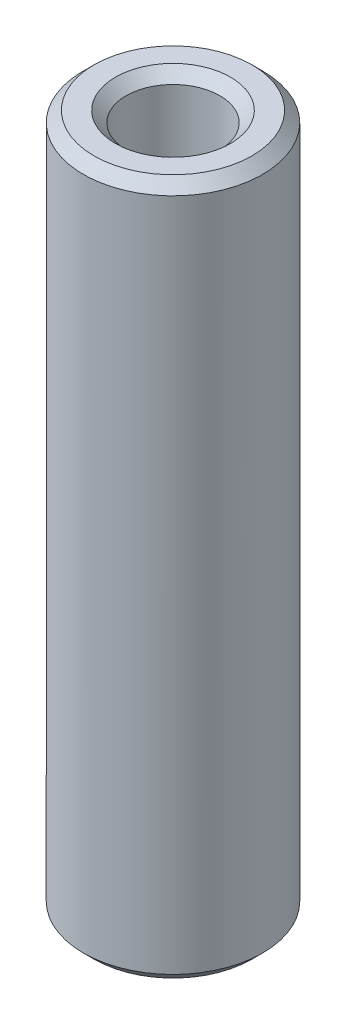
ISO-10303-21;
HEADER;
FILE_DESCRIPTION(('STEP AP214'),'2;1');
FILE_NAME('part.step','',(''),(''),'','','');
FILE_SCHEMA(('AUTOMOTIVE_DESIGN { 1 0 10303 214 1 1 1 1 }'));
ENDSEC;
DATA;
#1=APPLICATION_CONTEXT('core data for automotive mechanical design processes');
#2=APPLICATION_PROTOCOL_DEFINITION('international standard','automotive_design',2000,#1);
#3=PRODUCT_CONTEXT('',#1,'mechanical');
#4=PRODUCT('Part','Part','',(#3));
#5=PRODUCT_RELATED_PRODUCT_CATEGORY('part','',(#4));
#6=PRODUCT_DEFINITION_FORMATION('','',#4);
#7=PRODUCT_DEFINITION_CONTEXT('part definition',#1,'design');
#8=PRODUCT_DEFINITION('design','',#6,#7);
#9=PRODUCT_DEFINITION_SHAPE('','',#8);
#10=(LENGTH_UNIT() NAMED_UNIT(*) SI_UNIT(.MILLI.,.METRE.));
#11=(NAMED_UNIT(*) PLANE_ANGLE_UNIT() SI_UNIT($,.RADIAN.));
#12=(NAMED_UNIT(*) SI_UNIT($,.STERADIAN.) SOLID_ANGLE_UNIT());
#13=UNCERTAINTY_MEASURE_WITH_UNIT(LENGTH_MEASURE(1.E-05),#10,'distance_accuracy_value','');
#14=(GEOMETRIC_REPRESENTATION_CONTEXT(3) GLOBAL_UNCERTAINTY_ASSIGNED_CONTEXT((#13)) GLOBAL_UNIT_ASSIGNED_CONTEXT((#10,
#11,#12)) REPRESENTATION_CONTEXT('',''));
#15=CARTESIAN_POINT('',(0.,0.,0.));
#16=DIRECTION('',(0.,0.,1.));
#17=DIRECTION('',(1.,0.,0.));
#18=AXIS2_PLACEMENT_3D('',#15,#16,#17);
#19=CARTESIAN_POINT('',(0.,26.,0.));
#20=DIRECTION('',(0.,1.,0.));
#21=DIRECTION('',(0.,0.,1.));
#22=AXIS2_PLACEMENT_3D('',#19,#20,#21);
#23=PLANE('',#22);
#24=CARTESIAN_POINT('',(0.,26.,0.));
#25=DIRECTION('',(0.,1.,0.));
#26=DIRECTION('',(0.,0.,1.));
#27=AXIS2_PLACEMENT_3D('',#24,#25,#26);
#28=CIRCLE('',#27,2.95000000000001);
#29=CARTESIAN_POINT('',(0.,26.,2.95000000000001));
#30=VERTEX_POINT('',#29);
#31=EDGE_CURVE('E10',#30,#30,#28,.T.);
#32=ORIENTED_EDGE('',*,*,#31,.T.);
#33=EDGE_LOOP('',(#32));
#34=FACE_BOUND('',#33,.T.);
#35=CARTESIAN_POINT('',(0.,26.,0.));
#36=DIRECTION('',(0.,1.,0.));
#37=DIRECTION('',(0.,0.,1.));
#38=AXIS2_PLACEMENT_3D('',#35,#36,#37);
#39=CIRCLE('',#38,2.15000000000001);
#40=CARTESIAN_POINT('',(0.,26.,2.15000000000001));
#41=VERTEX_POINT('',#40);
#42=EDGE_CURVE('E41',#41,#41,#39,.F.);
#43=ORIENTED_EDGE('',*,*,#42,.T.);
#44=EDGE_LOOP('',(#43));
#45=FACE_BOUND('',#44,.T.);
#46=ADVANCED_FACE('F33',(#34,#45),#23,.T.);
#47=CARTESIAN_POINT('',(0.,0.,0.));
#48=DIRECTION('',(0.,1.,0.));
#49=DIRECTION('',(0.,0.,1.));
#50=AXIS2_PLACEMENT_3D('',#47,#48,#49);
#51=PLANE('',#50);
#52=CARTESIAN_POINT('',(0.,0.,0.));
#53=DIRECTION('',(0.,1.,0.));
#54=DIRECTION('',(0.,0.,1.));
#55=AXIS2_PLACEMENT_3D('',#52,#53,#54);
#56=CIRCLE('',#55,2.94999999999998);
#57=CARTESIAN_POINT('',(0.,0.,2.94999999999998));
#58=VERTEX_POINT('',#57);
#59=EDGE_CURVE('E54',#58,#58,#56,.F.);
#60=ORIENTED_EDGE('',*,*,#59,.T.);
#61=EDGE_LOOP('',(#60));
#62=FACE_BOUND('',#61,.T.);
#63=CARTESIAN_POINT('',(0.,0.,0.));
#64=DIRECTION('',(0.,1.,0.));
#65=DIRECTION('',(0.,0.,1.));
#66=AXIS2_PLACEMENT_3D('',#63,#64,#65);
#67=CIRCLE('',#66,2.15);
#68=CARTESIAN_POINT('',(0.,0.,2.15));
#69=VERTEX_POINT('',#68);
#70=EDGE_CURVE('E57',#69,#69,#67,.T.);
#71=ORIENTED_EDGE('',*,*,#70,.T.);
#72=EDGE_LOOP('',(#71));
#73=FACE_BOUND('',#72,.T.);
#74=ADVANCED_FACE('F83',(#62,#73),#51,.F.);
#75=CARTESIAN_POINT('',(0.,26.,0.));
#76=DIRECTION('',(0.,-1.,0.));
#77=DIRECTION('',(0.,0.,-1.));
#78=AXIS2_PLACEMENT_3D('',#75,#76,#77);
#79=CYLINDRICAL_SURFACE('',#78,3.35);
#80=CARTESIAN_POINT('',(0.,0.400000000000022,0.));
#81=DIRECTION('',(0.,1.,0.));
#82=DIRECTION('',(0.,0.,1.));
#83=AXIS2_PLACEMENT_3D('',#80,#81,#82);
#84=CIRCLE('',#83,3.35);
#85=CARTESIAN_POINT('',(0.,0.400000000000018,-3.35));
#86=VERTEX_POINT('',#85);
#87=EDGE_CURVE('E60',#86,#86,#84,.T.);
#88=CARTESIAN_POINT('',(0.,25.6,0.));
#89=DIRECTION('',(0.,1.,0.));
#90=DIRECTION('',(0.,0.,1.));
#91=AXIS2_PLACEMENT_3D('',#88,#89,#90);
#92=CIRCLE('',#91,3.35);
#93=CARTESIAN_POINT('',(0.,25.6,-3.35));
#94=VERTEX_POINT('',#93);
#95=EDGE_CURVE('E63',#94,#94,#92,.F.);
#96=CARTESIAN_POINT('',(0.,0.400000000000018,-3.35));
#97=CARTESIAN_POINT('',(0.,0.662500000000018,-3.35));
#98=CARTESIAN_POINT('',(0.,0.925000000000018,-3.35));
#99=CARTESIAN_POINT('',(0.,1.45000000000002,-3.35));
#100=CARTESIAN_POINT('',(0.,1.71250000000002,-3.35));
#101=CARTESIAN_POINT('',(0.,2.23750000000002,-3.35));
#102=CARTESIAN_POINT('',(0.,2.50000000000002,-3.35));
#103=CARTESIAN_POINT('',(0.,3.02500000000002,-3.35));
#104=CARTESIAN_POINT('',(0.,3.28750000000002,-3.35));
#105=CARTESIAN_POINT('',(0.,3.81250000000002,-3.35));
#106=CARTESIAN_POINT('',(0.,4.07500000000002,-3.35));
#107=CARTESIAN_POINT('',(0.,4.60000000000002,-3.35));
#108=CARTESIAN_POINT('',(0.,4.86250000000002,-3.35));
#109=CARTESIAN_POINT('',(0.,5.38750000000002,-3.35));
#110=CARTESIAN_POINT('',(0.,5.65000000000002,-3.35));
#111=CARTESIAN_POINT('',(0.,6.17500000000002,-3.35));
#112=CARTESIAN_POINT('',(0.,6.43750000000002,-3.35));
#113=CARTESIAN_POINT('',(0.,6.96250000000002,-3.35));
#114=CARTESIAN_POINT('',(0.,7.22500000000002,-3.35));
#115=CARTESIAN_POINT('',(0.,7.75000000000002,-3.35));
#116=CARTESIAN_POINT('',(0.,8.01250000000002,-3.35));
#117=CARTESIAN_POINT('',(0.,8.53750000000002,-3.35));
#118=CARTESIAN_POINT('',(0.,8.80000000000002,-3.35));
#119=CARTESIAN_POINT('',(0.,9.32500000000002,-3.35));
#120=CARTESIAN_POINT('',(0.,9.58750000000001,-3.35));
#121=CARTESIAN_POINT('',(0.,10.1125,-3.35));
#122=CARTESIAN_POINT('',(0.,10.375,-3.35));
#123=CARTESIAN_POINT('',(0.,10.9,-3.35));
#124=CARTESIAN_POINT('',(0.,11.1625,-3.35));
#125=CARTESIAN_POINT('',(0.,11.6875,-3.35));
#126=CARTESIAN_POINT('',(0.,11.95,-3.35));
#127=CARTESIAN_POINT('',(0.,12.475,-3.35));
#128=CARTESIAN_POINT('',(0.,12.7375,-3.35));
#129=CARTESIAN_POINT('',(0.,13.2625,-3.35));
#130=CARTESIAN_POINT('',(0.,13.525,-3.35));
#131=CARTESIAN_POINT('',(0.,14.05,-3.35));
#132=CARTESIAN_POINT('',(0.,14.3125,-3.35));
#133=CARTESIAN_POINT('',(0.,14.8375,-3.35));
#134=CARTESIAN_POINT('',(0.,15.1,-3.35));
#135=CARTESIAN_POINT('',(0.,15.625,-3.35));
#136=CARTESIAN_POINT('',(0.,15.8875,-3.35));
#137=CARTESIAN_POINT('',(0.,16.4125,-3.35));
#138=CARTESIAN_POINT('',(0.,16.675,-3.35));
#139=CARTESIAN_POINT('',(0.,17.2,-3.35));
#140=CARTESIAN_POINT('',(0.,17.4625,-3.35));
#141=CARTESIAN_POINT('',(0.,17.9875,-3.35));
#142=CARTESIAN_POINT('',(0.,18.25,-3.35));
#143=CARTESIAN_POINT('',(0.,18.775,-3.35));
#144=CARTESIAN_POINT('',(0.,19.0375,-3.35));
#145=CARTESIAN_POINT('',(0.,19.5625,-3.35));
#146=CARTESIAN_POINT('',(0.,19.825,-3.35));
#147=CARTESIAN_POINT('',(0.,20.35,-3.35));
#148=CARTESIAN_POINT('',(0.,20.6125,-3.35));
#149=CARTESIAN_POINT('',(0.,21.1375,-3.35));
#150=CARTESIAN_POINT('',(0.,21.4,-3.35));
#151=CARTESIAN_POINT('',(0.,21.925,-3.35));
#152=CARTESIAN_POINT('',(0.,22.1875,-3.35));
#153=CARTESIAN_POINT('',(0.,22.7125,-3.35));
#154=CARTESIAN_POINT('',(0.,22.975,-3.35));
#155=CARTESIAN_POINT('',(0.,23.5,-3.35));
#156=CARTESIAN_POINT('',(0.,23.7625,-3.35));
#157=CARTESIAN_POINT('',(0.,24.2875,-3.35));
#158=CARTESIAN_POINT('',(0.,24.55,-3.35));
#159=CARTESIAN_POINT('',(0.,25.075,-3.35));
#160=CARTESIAN_POINT('',(0.,25.3375,-3.35));
#161=CARTESIAN_POINT('',(0.,25.6,-3.35));
#162=B_SPLINE_CURVE_WITH_KNOTS('',3,(#96,#97,#98,#99,#100,#101,#102,#103,#104,#105,#106,#107,
#108,#109,#110,#111,#112,#113,#114,#115,#116,#117,#118,#119,#120,#121,#122,#123,#124,#125,#126,
#127,#128,#129,#130,#131,#132,#133,#134,#135,#136,#137,#138,#139,#140,#141,#142,#143,#144,#145,
#146,#147,#148,#149,#150,#151,#152,#153,#154,#155,#156,#157,#158,#159,#160,#161),.UNSPECIFIED.,
.F.,.F.,(4,2,2,2,2,2,2,2,2,2,2,2,2,2,2,2,2,2,2,2,2,2,2,2,2,2,2,2,2,2,2,2,4),(0.,0.7875,1.575,
2.3625,3.15,3.9375,4.725,5.5125,6.3,7.0875,7.875,8.6625,9.45,10.2375,11.025,11.8125,12.6,
13.3875,14.175,14.9625,15.75,16.5375,17.325,18.1125,18.9,19.6875,20.475,21.2625,22.05,22.8375,
23.625,24.4125,25.2),.UNSPECIFIED.);
#163=EDGE_CURVE('BSEAM67',#86,#94,#162,.T.);
#164=ORIENTED_EDGE('',*,*,#87,.T.);
#165=ORIENTED_EDGE('',*,*,#95,.T.);
#166=ORIENTED_EDGE('',*,*,#163,.T.);
#167=ORIENTED_EDGE('',*,*,#163,.F.);
#168=EDGE_LOOP('',(#164,#166,#165,#167));
#169=FACE_BOUND('',#168,.T.);
#170=ADVANCED_FACE('F67',(#169),#79,.T.);
#171=CARTESIAN_POINT('',(0.,26.,0.));
#172=DIRECTION('',(0.,-1.,0.));
#173=DIRECTION('',(0.,0.,-1.));
#174=AXIS2_PLACEMENT_3D('',#171,#172,#173);
#175=CYLINDRICAL_SURFACE('',#174,1.75);
#176=CARTESIAN_POINT('',(0.,0.399999999999998,0.));
#177=DIRECTION('',(0.,1.,0.));
#178=DIRECTION('',(0.,0.,1.));
#179=AXIS2_PLACEMENT_3D('',#176,#177,#178);
#180=CIRCLE('',#179,1.75);
#181=CARTESIAN_POINT('',(0.,0.399999999999998,-1.75));
#182=VERTEX_POINT('',#181);
#183=EDGE_CURVE('E45',#182,#182,#180,.F.);
#184=CARTESIAN_POINT('',(0.,25.6,0.));
#185=DIRECTION('',(0.,1.,0.));
#186=DIRECTION('',(0.,0.,1.));
#187=AXIS2_PLACEMENT_3D('',#184,#185,#186);
#188=CIRCLE('',#187,1.75);
#189=CARTESIAN_POINT('',(0.,25.6,-1.75));
#190=VERTEX_POINT('',#189);
#191=EDGE_CURVE('E49',#190,#190,#188,.T.);
#192=CARTESIAN_POINT('',(0.,0.399999999999998,-1.75));
#193=CARTESIAN_POINT('',(0.,0.662499999999998,-1.75));
#194=CARTESIAN_POINT('',(0.,0.924999999999998,-1.75));
#195=CARTESIAN_POINT('',(0.,1.45,-1.75));
#196=CARTESIAN_POINT('',(0.,1.7125,-1.75));
#197=CARTESIAN_POINT('',(0.,2.2375,-1.75));
#198=CARTESIAN_POINT('',(0.,2.5,-1.75));
#199=CARTESIAN_POINT('',(0.,3.025,-1.75));
#200=CARTESIAN_POINT('',(0.,3.2875,-1.75));
#201=CARTESIAN_POINT('',(0.,3.8125,-1.75));
#202=CARTESIAN_POINT('',(0.,4.075,-1.75));
#203=CARTESIAN_POINT('',(0.,4.59999999999999,-1.75));
#204=CARTESIAN_POINT('',(0.,4.86249999999999,-1.75));
#205=CARTESIAN_POINT('',(0.,5.38749999999999,-1.75));
#206=CARTESIAN_POINT('',(0.,5.64999999999999,-1.75));
#207=CARTESIAN_POINT('',(0.,6.17499999999999,-1.75));
#208=CARTESIAN_POINT('',(0.,6.43749999999999,-1.75));
#209=CARTESIAN_POINT('',(0.,6.96249999999999,-1.75));
#210=CARTESIAN_POINT('',(0.,7.22499999999999,-1.75));
#211=CARTESIAN_POINT('',(0.,7.74999999999999,-1.75));
#212=CARTESIAN_POINT('',(0.,8.01249999999999,-1.75));
#213=CARTESIAN_POINT('',(0.,8.53749999999999,-1.75));
#214=CARTESIAN_POINT('',(0.,8.79999999999999,-1.75));
#215=CARTESIAN_POINT('',(0.,9.32499999999999,-1.75));
#216=CARTESIAN_POINT('',(0.,9.58749999999999,-1.75));
#217=CARTESIAN_POINT('',(0.,10.1125,-1.75));
#218=CARTESIAN_POINT('',(0.,10.375,-1.75));
#219=CARTESIAN_POINT('',(0.,10.9,-1.75));
#220=CARTESIAN_POINT('',(0.,11.1625,-1.75));
#221=CARTESIAN_POINT('',(0.,11.6875,-1.75));
#222=CARTESIAN_POINT('',(0.,11.95,-1.75));
#223=CARTESIAN_POINT('',(0.,12.475,-1.75));
#224=CARTESIAN_POINT('',(0.,12.7375,-1.75));
#225=CARTESIAN_POINT('',(0.,13.2625,-1.75));
#226=CARTESIAN_POINT('',(0.,13.525,-1.75));
#227=CARTESIAN_POINT('',(0.,14.05,-1.75));
#228=CARTESIAN_POINT('',(0.,14.3125,-1.75));
#229=CARTESIAN_POINT('',(0.,14.8375,-1.75));
#230=CARTESIAN_POINT('',(0.,15.1,-1.75));
#231=CARTESIAN_POINT('',(0.,15.625,-1.75));
#232=CARTESIAN_POINT('',(0.,15.8875,-1.75));
#233=CARTESIAN_POINT('',(0.,16.4125,-1.75));
#234=CARTESIAN_POINT('',(0.,16.675,-1.75));
#235=CARTESIAN_POINT('',(0.,17.2,-1.75));
#236=CARTESIAN_POINT('',(0.,17.4625,-1.75));
#237=CARTESIAN_POINT('',(0.,17.9875,-1.75));
#238=CARTESIAN_POINT('',(0.,18.25,-1.75));
#239=CARTESIAN_POINT('',(0.,18.775,-1.75));
#240=CARTESIAN_POINT('',(0.,19.0375,-1.75));
#241=CARTESIAN_POINT('',(0.,19.5625,-1.75));
#242=CARTESIAN_POINT('',(0.,19.825,-1.75));
#243=CARTESIAN_POINT('',(0.,20.35,-1.75));
#244=CARTESIAN_POINT('',(0.,20.6125,-1.75));
#245=CARTESIAN_POINT('',(0.,21.1375,-1.75));
#246=CARTESIAN_POINT('',(0.,21.4,-1.75));
#247=CARTESIAN_POINT('',(0.,21.925,-1.75));
#248=CARTESIAN_POINT('',(0.,22.1875,-1.75));
#249=CARTESIAN_POINT('',(0.,22.7125,-1.75));
#250=CARTESIAN_POINT('',(0.,22.975,-1.75));
#251=CARTESIAN_POINT('',(0.,23.5,-1.75));
#252=CARTESIAN_POINT('',(0.,23.7625,-1.75));
#253=CARTESIAN_POINT('',(0.,24.2875,-1.75));
#254=CARTESIAN_POINT('',(0.,24.55,-1.75));
#255=CARTESIAN_POINT('',(0.,25.075,-1.75));
#256=CARTESIAN_POINT('',(0.,25.3375,-1.75));
#257=CARTESIAN_POINT('',(0.,25.6,-1.75));
#258=B_SPLINE_CURVE_WITH_KNOTS('',3,(#192,#193,#194,#195,#196,#197,#198,#199,#200,#201,#202,
#203,#204,#205,#206,#207,#208,#209,#210,#211,#212,#213,#214,#215,#216,#217,#218,#219,#220,#221,
#222,#223,#224,#225,#226,#227,#228,#229,#230,#231,#232,#233,#234,#235,#236,#237,#238,#239,#240,
#241,#242,#243,#244,#245,#246,#247,#248,#249,#250,#251,#252,#253,#254,#255,#256,#257),
.UNSPECIFIED.,.F.,.F.,(4,2,2,2,2,2,2,2,2,2,2,2,2,2,2,2,2,2,2,2,2,2,2,2,2,2,2,2,2,2,2,2,4),(0.,
0.7875,1.575,2.3625,3.15,3.9375,4.725,5.5125,6.3,7.0875,7.875,8.6625,9.44999999999999,10.2375,
11.025,11.8125,12.6,13.3875,14.175,14.9625,15.75,16.5375,17.325,18.1125,18.9,19.6875,20.475,
21.2625,22.05,22.8375,23.625,24.4125,25.2),.UNSPECIFIED.);
#259=EDGE_CURVE('BSEAM91',#182,#190,#258,.T.);
#260=ORIENTED_EDGE('',*,*,#183,.T.);
#261=ORIENTED_EDGE('',*,*,#191,.T.);
#262=ORIENTED_EDGE('',*,*,#259,.T.);
#263=ORIENTED_EDGE('',*,*,#259,.F.);
#264=EDGE_LOOP('',(#260,#262,#261,#263));
#265=FACE_BOUND('',#264,.T.);
#266=ADVANCED_FACE('F91',(#265),#175,.F.);
#267=CARTESIAN_POINT('',(0.,0.400000000000022,0.));
#268=DIRECTION('',(0.,1.,0.));
#269=DIRECTION('',(0.,0.,1.));
#270=AXIS2_PLACEMENT_3D('',#267,#268,#269);
#271=CONICAL_SURFACE('',#270,3.35,0.785398163397447);
#272=ORIENTED_EDGE('',*,*,#59,.F.);
#273=EDGE_LOOP('',(#272));
#274=FACE_BOUND('',#273,.T.);
#275=ORIENTED_EDGE('',*,*,#87,.F.);
#276=EDGE_LOOP('',(#275));
#277=FACE_BOUND('',#276,.T.);
#278=ADVANCED_FACE('F78',(#274,#277),#271,.T.);
#279=CARTESIAN_POINT('',(0.,0.,0.));
#280=DIRECTION('',(0.,-1.,0.));
#281=DIRECTION('',(0.,0.,-1.));
#282=AXIS2_PLACEMENT_3D('',#279,#280,#281);
#283=CONICAL_SURFACE('',#282,2.15,0.785398163397446);
#284=ORIENTED_EDGE('',*,*,#183,.F.);
#285=EDGE_LOOP('',(#284));
#286=FACE_BOUND('',#285,.T.);
#287=ORIENTED_EDGE('',*,*,#70,.F.);
#288=EDGE_LOOP('',(#287));
#289=FACE_BOUND('',#288,.T.);
#290=ADVANCED_FACE('F72',(#286,#289),#283,.F.);
#291=CARTESIAN_POINT('',(0.,26.,0.));
#292=DIRECTION('',(0.,-1.,0.));
#293=DIRECTION('',(0.,0.,-1.));
#294=AXIS2_PLACEMENT_3D('',#291,#292,#293);
#295=CONICAL_SURFACE('',#294,2.95000000000001,0.785398163397442);
#296=ORIENTED_EDGE('',*,*,#95,.F.);
#297=EDGE_LOOP('',(#296));
#298=FACE_BOUND('',#297,.T.);
#299=ORIENTED_EDGE('',*,*,#31,.F.);
#300=EDGE_LOOP('',(#299));
#301=FACE_BOUND('',#300,.T.);
#302=ADVANCED_FACE('F69',(#298,#301),#295,.T.);
#303=CARTESIAN_POINT('',(0.,25.6,0.));
#304=DIRECTION('',(0.,1.,0.));
#305=DIRECTION('',(0.,0.,1.));
#306=AXIS2_PLACEMENT_3D('',#303,#304,#305);
#307=CONICAL_SURFACE('',#306,1.75,0.785398163397441);
#308=ORIENTED_EDGE('',*,*,#42,.F.);
#309=EDGE_LOOP('',(#308));
#310=FACE_BOUND('',#309,.T.);
#311=ORIENTED_EDGE('',*,*,#191,.F.);
#312=EDGE_LOOP('',(#311));
#313=FACE_BOUND('',#312,.T.);
#314=ADVANCED_FACE('F36',(#310,#313),#307,.F.);
#315=CLOSED_SHELL('',(#46,#74,#170,#266,#278,#290,#302,#314));
#316=MANIFOLD_SOLID_BREP('B2',#315);
#317=ADVANCED_BREP_SHAPE_REPRESENTATION('',(#18,#316),#14);
#318=SHAPE_DEFINITION_REPRESENTATION(#9,#317);
ENDSEC;
END-ISO-10303-21;
